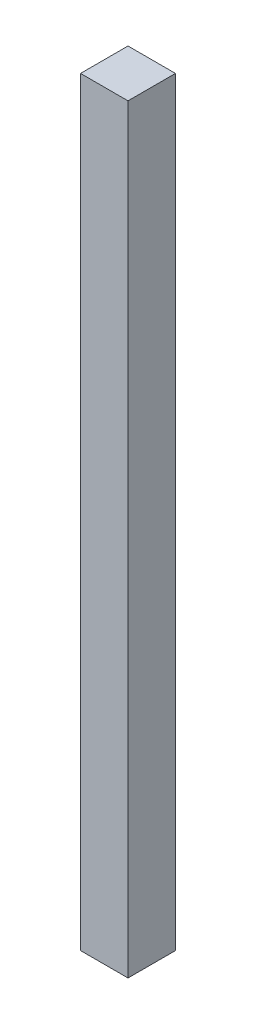
ISO-10303-21;
HEADER;
FILE_DESCRIPTION(('STEP AP214'),'2;1');
FILE_NAME('part.step','',(''),(''),'','','');
FILE_SCHEMA(('AUTOMOTIVE_DESIGN { 1 0 10303 214 1 1 1 1 }'));
ENDSEC;
DATA;
#1=APPLICATION_CONTEXT('core data for automotive mechanical design processes');
#2=APPLICATION_PROTOCOL_DEFINITION('international standard','automotive_design',2000,#1);
#3=PRODUCT_CONTEXT('',#1,'mechanical');
#4=PRODUCT('Part','Part','',(#3));
#5=PRODUCT_RELATED_PRODUCT_CATEGORY('part','',(#4));
#6=PRODUCT_DEFINITION_FORMATION('','',#4);
#7=PRODUCT_DEFINITION_CONTEXT('part definition',#1,'design');
#8=PRODUCT_DEFINITION('design','',#6,#7);
#9=PRODUCT_DEFINITION_SHAPE('','',#8);
#10=(LENGTH_UNIT() NAMED_UNIT(*) SI_UNIT(.MILLI.,.METRE.));
#11=(NAMED_UNIT(*) PLANE_ANGLE_UNIT() SI_UNIT($,.RADIAN.));
#12=(NAMED_UNIT(*) SI_UNIT($,.STERADIAN.) SOLID_ANGLE_UNIT());
#13=UNCERTAINTY_MEASURE_WITH_UNIT(LENGTH_MEASURE(1.E-05),#10,'distance_accuracy_value','');
#14=(GEOMETRIC_REPRESENTATION_CONTEXT(3) GLOBAL_UNCERTAINTY_ASSIGNED_CONTEXT((#13)) GLOBAL_UNIT_ASSIGNED_CONTEXT((#10,
#11,#12)) REPRESENTATION_CONTEXT('',''));
#15=CARTESIAN_POINT('',(0.,0.,0.));
#16=DIRECTION('',(0.,0.,1.));
#17=DIRECTION('',(1.,0.,0.));
#18=AXIS2_PLACEMENT_3D('',#15,#16,#17);
#19=CARTESIAN_POINT('',(0.,203.2,0.));
#20=DIRECTION('',(1.,0.,0.));
#21=DIRECTION('',(0.,0.,-1.));
#22=AXIS2_PLACEMENT_3D('',#19,#20,#21);
#23=PLANE('',#22);
#24=DIRECTION('',(0.,0.,1.));
#25=VECTOR('',#24,1.);
#26=CARTESIAN_POINT('',(0.,0.,0.));
#27=LINE('',#26,#25);
#28=CARTESIAN_POINT('',(0.,0.,-12.7));
#29=VERTEX_POINT('',#28);
#30=CARTESIAN_POINT('',(0.,0.,0.));
#31=VERTEX_POINT('',#30);
#32=EDGE_CURVE('E104',#29,#31,#27,.T.);
#33=ORIENTED_EDGE('',*,*,#32,.T.);
#34=DIRECTION('',(0.,-1.,0.));
#35=VECTOR('',#34,1.);
#36=CARTESIAN_POINT('',(0.,203.2,0.));
#37=LINE('',#36,#35);
#38=CARTESIAN_POINT('',(0.,203.2,0.));
#39=VERTEX_POINT('',#38);
#40=EDGE_CURVE('E11',#39,#31,#37,.T.);
#41=ORIENTED_EDGE('',*,*,#40,.F.);
#42=DIRECTION('',(0.,0.,1.));
#43=VECTOR('',#42,1.);
#44=CARTESIAN_POINT('',(0.,203.2,0.));
#45=LINE('',#44,#43);
#46=CARTESIAN_POINT('',(0.,203.2,-12.7));
#47=VERTEX_POINT('',#46);
#48=EDGE_CURVE('E92',#47,#39,#45,.T.);
#49=ORIENTED_EDGE('',*,*,#48,.F.);
#50=DIRECTION('',(0.,-1.,0.));
#51=VECTOR('',#50,1.);
#52=CARTESIAN_POINT('',(0.,203.2,-12.7));
#53=LINE('',#52,#51);
#54=EDGE_CURVE('E100',#47,#29,#53,.T.);
#55=ORIENTED_EDGE('',*,*,#54,.T.);
#56=EDGE_LOOP('',(#33,#41,#49,#55));
#57=FACE_BOUND('',#56,.T.);
#58=ADVANCED_FACE('F41',(#57),#23,.F.);
#59=CARTESIAN_POINT('',(0.,203.2,0.));
#60=DIRECTION('',(0.,0.,-1.));
#61=DIRECTION('',(-1.,0.,0.));
#62=AXIS2_PLACEMENT_3D('',#59,#60,#61);
#63=PLANE('',#62);
#64=DIRECTION('',(1.,0.,0.));
#65=VECTOR('',#64,1.);
#66=CARTESIAN_POINT('',(0.,0.,0.));
#67=LINE('',#66,#65);
#68=CARTESIAN_POINT('',(12.7,0.,0.));
#69=VERTEX_POINT('',#68);
#70=EDGE_CURVE('E96',#31,#69,#67,.T.);
#71=ORIENTED_EDGE('',*,*,#70,.T.);
#72=DIRECTION('',(0.,-1.,0.));
#73=VECTOR('',#72,1.);
#74=CARTESIAN_POINT('',(12.7,203.2,0.));
#75=LINE('',#74,#73);
#76=CARTESIAN_POINT('',(12.7,203.2,0.));
#77=VERTEX_POINT('',#76);
#78=EDGE_CURVE('E49',#77,#69,#75,.T.);
#79=ORIENTED_EDGE('',*,*,#78,.F.);
#80=DIRECTION('',(1.,0.,0.));
#81=VECTOR('',#80,1.);
#82=CARTESIAN_POINT('',(0.,203.2,0.));
#83=LINE('',#82,#81);
#84=EDGE_CURVE('E87',#39,#77,#83,.T.);
#85=ORIENTED_EDGE('',*,*,#84,.F.);
#86=ORIENTED_EDGE('',*,*,#40,.T.);
#87=EDGE_LOOP('',(#71,#79,#85,#86));
#88=FACE_BOUND('',#87,.T.);
#89=ADVANCED_FACE('F95',(#88),#63,.F.);
#90=CARTESIAN_POINT('',(12.7,203.2,0.));
#91=DIRECTION('',(-1.,0.,0.));
#92=DIRECTION('',(0.,0.,1.));
#93=AXIS2_PLACEMENT_3D('',#90,#91,#92);
#94=PLANE('',#93);
#95=DIRECTION('',(0.,0.,-1.));
#96=VECTOR('',#95,1.);
#97=CARTESIAN_POINT('',(12.7,0.,0.));
#98=LINE('',#97,#96);
#99=CARTESIAN_POINT('',(12.7,0.,-12.7));
#100=VERTEX_POINT('',#99);
#101=EDGE_CURVE('E74',#69,#100,#98,.T.);
#102=ORIENTED_EDGE('',*,*,#101,.T.);
#103=DIRECTION('',(0.,-1.,0.));
#104=VECTOR('',#103,1.);
#105=CARTESIAN_POINT('',(12.7,203.2,-12.7));
#106=LINE('',#105,#104);
#107=CARTESIAN_POINT('',(12.7,203.2,-12.7));
#108=VERTEX_POINT('',#107);
#109=EDGE_CURVE('E97',#108,#100,#106,.T.);
#110=ORIENTED_EDGE('',*,*,#109,.F.);
#111=DIRECTION('',(0.,0.,-1.));
#112=VECTOR('',#111,1.);
#113=CARTESIAN_POINT('',(12.7,203.2,0.));
#114=LINE('',#113,#112);
#115=EDGE_CURVE('E90',#77,#108,#114,.T.);
#116=ORIENTED_EDGE('',*,*,#115,.F.);
#117=ORIENTED_EDGE('',*,*,#78,.T.);
#118=EDGE_LOOP('',(#102,#110,#116,#117));
#119=FACE_BOUND('',#118,.T.);
#120=ADVANCED_FACE('F98',(#119),#94,.F.);
#121=CARTESIAN_POINT('',(0.,203.2,-12.7));
#122=DIRECTION('',(0.,0.,1.));
#123=DIRECTION('',(1.,0.,0.));
#124=AXIS2_PLACEMENT_3D('',#121,#122,#123);
#125=PLANE('',#124);
#126=DIRECTION('',(-1.,0.,0.));
#127=VECTOR('',#126,1.);
#128=CARTESIAN_POINT('',(0.,0.,-12.7));
#129=LINE('',#128,#127);
#130=EDGE_CURVE('E80',#100,#29,#129,.T.);
#131=ORIENTED_EDGE('',*,*,#130,.T.);
#132=ORIENTED_EDGE('',*,*,#54,.F.);
#133=DIRECTION('',(-1.,0.,0.));
#134=VECTOR('',#133,1.);
#135=CARTESIAN_POINT('',(0.,203.2,-12.7));
#136=LINE('',#135,#134);
#137=EDGE_CURVE('E57',#108,#47,#136,.T.);
#138=ORIENTED_EDGE('',*,*,#137,.F.);
#139=ORIENTED_EDGE('',*,*,#109,.T.);
#140=EDGE_LOOP('',(#131,#132,#138,#139));
#141=FACE_BOUND('',#140,.T.);
#142=ADVANCED_FACE('F111',(#141),#125,.F.);
#143=CARTESIAN_POINT('',(0.,203.2,0.));
#144=DIRECTION('',(0.,-1.,0.));
#145=DIRECTION('',(0.,0.,-1.));
#146=AXIS2_PLACEMENT_3D('',#143,#144,#145);
#147=PLANE('',#146);
#148=ORIENTED_EDGE('',*,*,#48,.T.);
#149=ORIENTED_EDGE('',*,*,#84,.T.);
#150=ORIENTED_EDGE('',*,*,#115,.T.);
#151=ORIENTED_EDGE('',*,*,#137,.T.);
#152=EDGE_LOOP('',(#148,#149,#150,#151));
#153=FACE_BOUND('',#152,.T.);
#154=ADVANCED_FACE('F88',(#153),#147,.F.);
#155=CARTESIAN_POINT('',(0.,0.,0.));
#156=DIRECTION('',(0.,-1.,0.));
#157=DIRECTION('',(0.,0.,-1.));
#158=AXIS2_PLACEMENT_3D('',#155,#156,#157);
#159=PLANE('',#158);
#160=ORIENTED_EDGE('',*,*,#32,.F.);
#161=ORIENTED_EDGE('',*,*,#130,.F.);
#162=ORIENTED_EDGE('',*,*,#101,.F.);
#163=ORIENTED_EDGE('',*,*,#70,.F.);
#164=EDGE_LOOP('',(#160,#161,#162,#163));
#165=FACE_BOUND('',#164,.T.);
#166=ADVANCED_FACE('F114',(#165),#159,.T.);
#167=CLOSED_SHELL('',(#58,#89,#120,#142,#154,#166));
#168=MANIFOLD_SOLID_BREP('B2',#167);
#169=ADVANCED_BREP_SHAPE_REPRESENTATION('',(#18,#168),#14);
#170=SHAPE_DEFINITION_REPRESENTATION(#9,#169);
ENDSEC;
END-ISO-10303-21;
